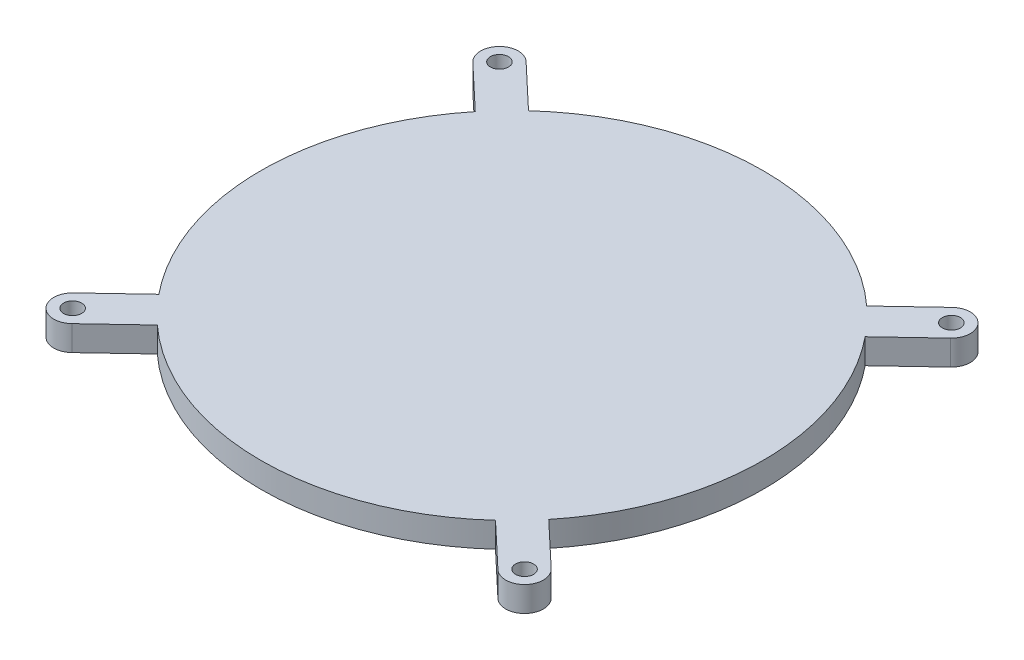
ISO-10303-21;
HEADER;
FILE_DESCRIPTION(('STEP AP214'),'2;1');
FILE_NAME('part.step','',(''),(''),'','','');
FILE_SCHEMA(('AUTOMOTIVE_DESIGN { 1 0 10303 214 1 1 1 1 }'));
ENDSEC;
DATA;
#1=APPLICATION_CONTEXT('core data for automotive mechanical design processes');
#2=APPLICATION_PROTOCOL_DEFINITION('international standard','automotive_design',2000,#1);
#3=PRODUCT_CONTEXT('',#1,'mechanical');
#4=PRODUCT('Part','Part','',(#3));
#5=PRODUCT_RELATED_PRODUCT_CATEGORY('part','',(#4));
#6=PRODUCT_DEFINITION_FORMATION('','',#4);
#7=PRODUCT_DEFINITION_CONTEXT('part definition',#1,'design');
#8=PRODUCT_DEFINITION('design','',#6,#7);
#9=PRODUCT_DEFINITION_SHAPE('','',#8);
#10=(LENGTH_UNIT() NAMED_UNIT(*) SI_UNIT(.MILLI.,.METRE.));
#11=(NAMED_UNIT(*) PLANE_ANGLE_UNIT() SI_UNIT($,.RADIAN.));
#12=(NAMED_UNIT(*) SI_UNIT($,.STERADIAN.) SOLID_ANGLE_UNIT());
#13=UNCERTAINTY_MEASURE_WITH_UNIT(LENGTH_MEASURE(1.E-05),#10,'distance_accuracy_value','');
#14=(GEOMETRIC_REPRESENTATION_CONTEXT(3) GLOBAL_UNCERTAINTY_ASSIGNED_CONTEXT((#13)) GLOBAL_UNIT_ASSIGNED_CONTEXT((#10,
#11,#12)) REPRESENTATION_CONTEXT('',''));
#15=CARTESIAN_POINT('',(0.,0.,0.));
#16=DIRECTION('',(0.,0.,1.));
#17=DIRECTION('',(1.,0.,0.));
#18=AXIS2_PLACEMENT_3D('',#15,#16,#17);
#19=CARTESIAN_POINT('',(45.,5.,-42.5));
#20=DIRECTION('',(0.,-1.,0.));
#21=DIRECTION('',(0.,0.,-1.));
#22=AXIS2_PLACEMENT_3D('',#19,#20,#21);
#23=CYLINDRICAL_SURFACE('',#22,3.75);
#24=CARTESIAN_POINT('',(45.,0.,-42.5));
#25=DIRECTION('',(0.,1.,0.));
#26=DIRECTION('',(0.,0.,1.));
#27=AXIS2_PLACEMENT_3D('',#24,#25,#26);
#28=CIRCLE('',#27,3.75);
#29=CARTESIAN_POINT('',(47.5748382486139,0.,-39.7737006779382));
#30=VERTEX_POINT('',#29);
#31=CARTESIAN_POINT('',(42.425161751386,0.,-45.2262993220618));
#32=VERTEX_POINT('',#31);
#33=EDGE_CURVE('E188',#30,#32,#28,.T.);
#34=ORIENTED_EDGE('',*,*,#33,.T.);
#35=DIRECTION('',(0.,-1.,0.));
#36=VECTOR('',#35,1.);
#37=CARTESIAN_POINT('',(42.425161751386,5.,-45.2262993220618));
#38=LINE('',#37,#36);
#39=CARTESIAN_POINT('',(42.425161751386,5.,-45.2262993220618));
#40=VERTEX_POINT('',#39);
#41=EDGE_CURVE('E11',#40,#32,#38,.T.);
#42=ORIENTED_EDGE('',*,*,#41,.F.);
#43=CARTESIAN_POINT('',(45.,5.,-42.5));
#44=DIRECTION('',(0.,1.,0.));
#45=DIRECTION('',(0.,0.,1.));
#46=AXIS2_PLACEMENT_3D('',#43,#44,#45);
#47=CIRCLE('',#46,3.75);
#48=CARTESIAN_POINT('',(47.5748382486139,5.,-39.7737006779382));
#49=VERTEX_POINT('',#48);
#50=EDGE_CURVE('E235',#49,#40,#47,.T.);
#51=ORIENTED_EDGE('',*,*,#50,.F.);
#52=DIRECTION('',(0.,-1.,0.));
#53=VECTOR('',#52,1.);
#54=CARTESIAN_POINT('',(47.5748382486139,5.,-39.7737006779382));
#55=LINE('',#54,#53);
#56=EDGE_CURVE('E184',#49,#30,#55,.T.);
#57=ORIENTED_EDGE('',*,*,#56,.T.);
#58=EDGE_LOOP('',(#34,#42,#51,#57));
#59=FACE_BOUND('',#58,.T.);
#60=ADVANCED_FACE('F39',(#59),#23,.T.);
#61=CARTESIAN_POINT('',(42.425161751386,5.,-45.2262993220618));
#62=DIRECTION('',(0.68662353296372,0.,0.727013152549814));
#63=DIRECTION('',(0.727013152549814,0.,-0.68662353296372));
#64=AXIS2_PLACEMENT_3D('',#61,#62,#63);
#65=PLANE('',#64);
#66=DIRECTION('',(-0.727013152549814,0.,0.68662353296372));
#67=VECTOR('',#66,1.);
#68=CARTESIAN_POINT('',(42.425161751386,0.,-45.2262993220618));
#69=LINE('',#68,#67);
#70=CARTESIAN_POINT('',(33.6734389788294,0.,-36.9607833702027));
#71=VERTEX_POINT('',#70);
#72=EDGE_CURVE('E192',#32,#71,#69,.T.);
#73=ORIENTED_EDGE('',*,*,#72,.T.);
#74=DIRECTION('',(0.,-1.,0.));
#75=VECTOR('',#74,1.);
#76=CARTESIAN_POINT('',(33.6734389788294,5.,-36.9607833702027));
#77=LINE('',#76,#75);
#78=CARTESIAN_POINT('',(33.6734389788294,5.,-36.9607833702027));
#79=VERTEX_POINT('',#78);
#80=EDGE_CURVE('E48',#79,#71,#77,.T.);
#81=ORIENTED_EDGE('',*,*,#80,.F.);
#82=DIRECTION('',(-0.727013152549814,0.,0.68662353296372));
#83=VECTOR('',#82,1.);
#84=CARTESIAN_POINT('',(42.425161751386,5.,-45.2262993220618));
#85=LINE('',#84,#83);
#86=EDGE_CURVE('E123',#40,#79,#85,.T.);
#87=ORIENTED_EDGE('',*,*,#86,.F.);
#88=ORIENTED_EDGE('',*,*,#41,.T.);
#89=EDGE_LOOP('',(#73,#81,#87,#88));
#90=FACE_BOUND('',#89,.T.);
#91=ADVANCED_FACE('F358',(#90),#65,.F.);
#92=CARTESIAN_POINT('',(0.,5.,0.));
#93=DIRECTION('',(0.,-1.,0.));
#94=DIRECTION('',(0.,0.,-1.));
#95=AXIS2_PLACEMENT_3D('',#92,#93,#94);
#96=CYLINDRICAL_SURFACE('',#95,50.);
#97=CARTESIAN_POINT('',(0.,0.,0.));
#98=DIRECTION('',(0.,1.,0.));
#99=DIRECTION('',(0.,0.,1.));
#100=AXIS2_PLACEMENT_3D('',#97,#98,#99);
#101=CIRCLE('',#100,50.);
#102=CARTESIAN_POINT('',(-33.6734389788294,0.,-36.9607833702027));
#103=VERTEX_POINT('',#102);
#104=EDGE_CURVE('E196',#71,#103,#101,.T.);
#105=ORIENTED_EDGE('',*,*,#104,.T.);
#106=DIRECTION('',(0.,-1.,0.));
#107=VECTOR('',#106,1.);
#108=CARTESIAN_POINT('',(-33.6734389788294,5.,-36.9607833702027));
#109=LINE('',#108,#107);
#110=CARTESIAN_POINT('',(-33.6734389788294,5.,-36.9607833702027));
#111=VERTEX_POINT('',#110);
#112=EDGE_CURVE('E278',#111,#103,#109,.T.);
#113=ORIENTED_EDGE('',*,*,#112,.F.);
#114=CARTESIAN_POINT('',(0.,5.,0.));
#115=DIRECTION('',(0.,1.,0.));
#116=DIRECTION('',(0.,0.,1.));
#117=AXIS2_PLACEMENT_3D('',#114,#115,#116);
#118=CIRCLE('',#117,50.);
#119=EDGE_CURVE('E288',#79,#111,#118,.T.);
#120=ORIENTED_EDGE('',*,*,#119,.F.);
#121=ORIENTED_EDGE('',*,*,#80,.T.);
#122=EDGE_LOOP('',(#105,#113,#120,#121));
#123=FACE_BOUND('',#122,.T.);
#124=ADVANCED_FACE('F286',(#123),#96,.T.);
#125=CARTESIAN_POINT('',(-42.4251617513861,5.,-45.2262993220618));
#126=DIRECTION('',(-0.686623532963716,0.,0.727013152549818));
#127=DIRECTION('',(0.727013152549818,0.,0.686623532963716));
#128=AXIS2_PLACEMENT_3D('',#125,#126,#127);
#129=PLANE('',#128);
#130=DIRECTION('',(-0.727013152549817,0.,-0.686623532963716));
#131=VECTOR('',#130,1.);
#132=CARTESIAN_POINT('',(-42.4251617513861,0.,-45.2262993220618));
#133=LINE('',#132,#131);
#134=CARTESIAN_POINT('',(-42.4251617513861,0.,-45.2262993220618));
#135=VERTEX_POINT('',#134);
#136=EDGE_CURVE('E199',#103,#135,#133,.T.);
#137=ORIENTED_EDGE('',*,*,#136,.T.);
#138=DIRECTION('',(0.,-1.,0.));
#139=VECTOR('',#138,1.);
#140=CARTESIAN_POINT('',(-42.4251617513861,5.,-45.2262993220618));
#141=LINE('',#140,#139);
#142=CARTESIAN_POINT('',(-42.4251617513861,5.,-45.2262993220618));
#143=VERTEX_POINT('',#142);
#144=EDGE_CURVE('E274',#143,#135,#141,.T.);
#145=ORIENTED_EDGE('',*,*,#144,.F.);
#146=DIRECTION('',(-0.727013152549817,0.,-0.686623532963716));
#147=VECTOR('',#146,1.);
#148=CARTESIAN_POINT('',(-42.4251617513861,5.,-45.2262993220618));
#149=LINE('',#148,#147);
#150=EDGE_CURVE('E307',#111,#143,#149,.T.);
#151=ORIENTED_EDGE('',*,*,#150,.F.);
#152=ORIENTED_EDGE('',*,*,#112,.T.);
#153=EDGE_LOOP('',(#137,#145,#151,#152));
#154=FACE_BOUND('',#153,.T.);
#155=ADVANCED_FACE('F297',(#154),#129,.F.);
#156=CARTESIAN_POINT('',(-45.,5.,-42.5));
#157=DIRECTION('',(0.,-1.,0.));
#158=DIRECTION('',(0.,0.,-1.));
#159=AXIS2_PLACEMENT_3D('',#156,#157,#158);
#160=CYLINDRICAL_SURFACE('',#159,3.75);
#161=CARTESIAN_POINT('',(-45.,0.,-42.5));
#162=DIRECTION('',(0.,1.,0.));
#163=DIRECTION('',(0.,0.,1.));
#164=AXIS2_PLACEMENT_3D('',#161,#162,#163);
#165=CIRCLE('',#164,3.75);
#166=CARTESIAN_POINT('',(-47.5748382486139,0.,-39.7737006779382));
#167=VERTEX_POINT('',#166);
#168=EDGE_CURVE('E202',#135,#167,#165,.T.);
#169=ORIENTED_EDGE('',*,*,#168,.T.);
#170=DIRECTION('',(0.,-1.,0.));
#171=VECTOR('',#170,1.);
#172=CARTESIAN_POINT('',(-47.5748382486139,5.,-39.7737006779382));
#173=LINE('',#172,#171);
#174=CARTESIAN_POINT('',(-47.5748382486139,5.,-39.7737006779382));
#175=VERTEX_POINT('',#174);
#176=EDGE_CURVE('E270',#175,#167,#173,.T.);
#177=ORIENTED_EDGE('',*,*,#176,.F.);
#178=CARTESIAN_POINT('',(-45.,5.,-42.5));
#179=DIRECTION('',(0.,1.,0.));
#180=DIRECTION('',(0.,0.,1.));
#181=AXIS2_PLACEMENT_3D('',#178,#179,#180);
#182=CIRCLE('',#181,3.75);
#183=EDGE_CURVE('E303',#143,#175,#182,.T.);
#184=ORIENTED_EDGE('',*,*,#183,.F.);
#185=ORIENTED_EDGE('',*,*,#144,.T.);
#186=EDGE_LOOP('',(#169,#177,#184,#185));
#187=FACE_BOUND('',#186,.T.);
#188=ADVANCED_FACE('F301',(#187),#160,.T.);
#189=CARTESIAN_POINT('',(-47.5748382486139,5.,-39.7737006779382));
#190=DIRECTION('',(0.686623532963717,0.,-0.727013152549817));
#191=DIRECTION('',(-0.727013152549817,0.,-0.686623532963717));
#192=AXIS2_PLACEMENT_3D('',#189,#190,#191);
#193=PLANE('',#192);
#194=DIRECTION('',(0.727013152549817,0.,0.686623532963717));
#195=VECTOR('',#194,1.);
#196=CARTESIAN_POINT('',(-47.5748382486139,0.,-39.7737006779382));
#197=LINE('',#196,#195);
#198=CARTESIAN_POINT('',(-38.8231154760573,0.,-31.5081847260791));
#199=VERTEX_POINT('',#198);
#200=EDGE_CURVE('E205',#167,#199,#197,.T.);
#201=ORIENTED_EDGE('',*,*,#200,.T.);
#202=DIRECTION('',(0.,-1.,0.));
#203=VECTOR('',#202,1.);
#204=CARTESIAN_POINT('',(-38.8231154760573,5.,-31.5081847260791));
#205=LINE('',#204,#203);
#206=CARTESIAN_POINT('',(-38.8231154760573,5.,-31.5081847260791));
#207=VERTEX_POINT('',#206);
#208=EDGE_CURVE('E266',#207,#199,#205,.T.);
#209=ORIENTED_EDGE('',*,*,#208,.F.);
#210=DIRECTION('',(0.727013152549817,0.,0.686623532963717));
#211=VECTOR('',#210,1.);
#212=CARTESIAN_POINT('',(-47.5748382486139,5.,-39.7737006779382));
#213=LINE('',#212,#211);
#214=EDGE_CURVE('E306',#175,#207,#213,.T.);
#215=ORIENTED_EDGE('',*,*,#214,.F.);
#216=ORIENTED_EDGE('',*,*,#176,.T.);
#217=EDGE_LOOP('',(#201,#209,#215,#216));
#218=FACE_BOUND('',#217,.T.);
#219=ADVANCED_FACE('F371',(#218),#193,.F.);
#220=CARTESIAN_POINT('',(0.,5.,0.));
#221=DIRECTION('',(0.,-1.,0.));
#222=DIRECTION('',(0.,0.,-1.));
#223=AXIS2_PLACEMENT_3D('',#220,#221,#222);
#224=CYLINDRICAL_SURFACE('',#223,50.);
#225=CARTESIAN_POINT('',(0.,0.,0.));
#226=DIRECTION('',(0.,1.,0.));
#227=DIRECTION('',(0.,0.,1.));
#228=AXIS2_PLACEMENT_3D('',#225,#226,#227);
#229=CIRCLE('',#228,50.);
#230=CARTESIAN_POINT('',(-38.8231154760573,0.,31.5081847260791));
#231=VERTEX_POINT('',#230);
#232=EDGE_CURVE('E208',#199,#231,#229,.T.);
#233=ORIENTED_EDGE('',*,*,#232,.T.);
#234=DIRECTION('',(0.,-1.,0.));
#235=VECTOR('',#234,1.);
#236=CARTESIAN_POINT('',(-38.8231154760573,5.,31.5081847260791));
#237=LINE('',#236,#235);
#238=CARTESIAN_POINT('',(-38.8231154760573,5.,31.5081847260791));
#239=VERTEX_POINT('',#238);
#240=EDGE_CURVE('E262',#239,#231,#237,.T.);
#241=ORIENTED_EDGE('',*,*,#240,.F.);
#242=CARTESIAN_POINT('',(0.,5.,0.));
#243=DIRECTION('',(0.,1.,0.));
#244=DIRECTION('',(0.,0.,1.));
#245=AXIS2_PLACEMENT_3D('',#242,#243,#244);
#246=CIRCLE('',#245,50.);
#247=EDGE_CURVE('E311',#207,#239,#246,.T.);
#248=ORIENTED_EDGE('',*,*,#247,.F.);
#249=ORIENTED_EDGE('',*,*,#208,.T.);
#250=EDGE_LOOP('',(#233,#241,#248,#249));
#251=FACE_BOUND('',#250,.T.);
#252=ADVANCED_FACE('F374',(#251),#224,.T.);
#253=CARTESIAN_POINT('',(-47.5748382486139,5.,39.7737006779382));
#254=DIRECTION('',(0.686623532963716,0.,0.727013152549818));
#255=DIRECTION('',(0.727013152549818,0.,-0.686623532963716));
#256=AXIS2_PLACEMENT_3D('',#253,#254,#255);
#257=PLANE('',#256);
#258=DIRECTION('',(-0.727013152549818,0.,0.686623532963716));
#259=VECTOR('',#258,1.);
#260=CARTESIAN_POINT('',(-47.5748382486139,0.,39.7737006779382));
#261=LINE('',#260,#259);
#262=CARTESIAN_POINT('',(-47.5748382486139,0.,39.7737006779382));
#263=VERTEX_POINT('',#262);
#264=EDGE_CURVE('E211',#231,#263,#261,.T.);
#265=ORIENTED_EDGE('',*,*,#264,.T.);
#266=DIRECTION('',(0.,-1.,0.));
#267=VECTOR('',#266,1.);
#268=CARTESIAN_POINT('',(-47.5748382486139,5.,39.7737006779382));
#269=LINE('',#268,#267);
#270=CARTESIAN_POINT('',(-47.5748382486139,5.,39.7737006779382));
#271=VERTEX_POINT('',#270);
#272=EDGE_CURVE('E258',#271,#263,#269,.T.);
#273=ORIENTED_EDGE('',*,*,#272,.F.);
#274=DIRECTION('',(-0.727013152549818,0.,0.686623532963716));
#275=VECTOR('',#274,1.);
#276=CARTESIAN_POINT('',(-47.5748382486139,5.,39.7737006779382));
#277=LINE('',#276,#275);
#278=EDGE_CURVE('E318',#239,#271,#277,.T.);
#279=ORIENTED_EDGE('',*,*,#278,.F.);
#280=ORIENTED_EDGE('',*,*,#240,.T.);
#281=EDGE_LOOP('',(#265,#273,#279,#280));
#282=FACE_BOUND('',#281,.T.);
#283=ADVANCED_FACE('F378',(#282),#257,.F.);
#284=CARTESIAN_POINT('',(-45.,5.,42.5));
#285=DIRECTION('',(0.,-1.,0.));
#286=DIRECTION('',(0.,0.,-1.));
#287=AXIS2_PLACEMENT_3D('',#284,#285,#286);
#288=CYLINDRICAL_SURFACE('',#287,3.74999999999999);
#289=CARTESIAN_POINT('',(-45.,0.,42.5));
#290=DIRECTION('',(0.,1.,0.));
#291=DIRECTION('',(0.,0.,1.));
#292=AXIS2_PLACEMENT_3D('',#289,#290,#291);
#293=CIRCLE('',#292,3.74999999999999);
#294=CARTESIAN_POINT('',(-42.4251617513861,0.,45.2262993220618));
#295=VERTEX_POINT('',#294);
#296=EDGE_CURVE('E214',#263,#295,#293,.T.);
#297=ORIENTED_EDGE('',*,*,#296,.T.);
#298=DIRECTION('',(0.,-1.,0.));
#299=VECTOR('',#298,1.);
#300=CARTESIAN_POINT('',(-42.4251617513861,5.,45.2262993220618));
#301=LINE('',#300,#299);
#302=CARTESIAN_POINT('',(-42.4251617513861,5.,45.2262993220618));
#303=VERTEX_POINT('',#302);
#304=EDGE_CURVE('E254',#303,#295,#301,.T.);
#305=ORIENTED_EDGE('',*,*,#304,.F.);
#306=CARTESIAN_POINT('',(-45.,5.,42.5));
#307=DIRECTION('',(0.,1.,0.));
#308=DIRECTION('',(0.,0.,1.));
#309=AXIS2_PLACEMENT_3D('',#306,#307,#308);
#310=CIRCLE('',#309,3.74999999999999);
#311=EDGE_CURVE('E321',#271,#303,#310,.T.);
#312=ORIENTED_EDGE('',*,*,#311,.F.);
#313=ORIENTED_EDGE('',*,*,#272,.T.);
#314=EDGE_LOOP('',(#297,#305,#312,#313));
#315=FACE_BOUND('',#314,.T.);
#316=ADVANCED_FACE('F382',(#315),#288,.T.);
#317=CARTESIAN_POINT('',(-42.4251617513861,5.,45.2262993220618));
#318=DIRECTION('',(-0.686623532963718,0.,-0.727013152549816));
#319=DIRECTION('',(-0.727013152549816,0.,0.686623532963718));
#320=AXIS2_PLACEMENT_3D('',#317,#318,#319);
#321=PLANE('',#320);
#322=DIRECTION('',(0.727013152549816,0.,-0.686623532963718));
#323=VECTOR('',#322,1.);
#324=CARTESIAN_POINT('',(-42.4251617513861,0.,45.2262993220618));
#325=LINE('',#324,#323);
#326=CARTESIAN_POINT('',(-33.6734389788294,0.,36.9607833702027));
#327=VERTEX_POINT('',#326);
#328=EDGE_CURVE('E217',#295,#327,#325,.T.);
#329=ORIENTED_EDGE('',*,*,#328,.T.);
#330=DIRECTION('',(0.,-1.,0.));
#331=VECTOR('',#330,1.);
#332=CARTESIAN_POINT('',(-33.6734389788294,5.,36.9607833702027));
#333=LINE('',#332,#331);
#334=CARTESIAN_POINT('',(-33.6734389788294,5.,36.9607833702027));
#335=VERTEX_POINT('',#334);
#336=EDGE_CURVE('E250',#335,#327,#333,.T.);
#337=ORIENTED_EDGE('',*,*,#336,.F.);
#338=DIRECTION('',(0.727013152549816,0.,-0.686623532963718));
#339=VECTOR('',#338,1.);
#340=CARTESIAN_POINT('',(-42.4251617513861,5.,45.2262993220618));
#341=LINE('',#340,#339);
#342=EDGE_CURVE('E324',#303,#335,#341,.T.);
#343=ORIENTED_EDGE('',*,*,#342,.F.);
#344=ORIENTED_EDGE('',*,*,#304,.T.);
#345=EDGE_LOOP('',(#329,#337,#343,#344));
#346=FACE_BOUND('',#345,.T.);
#347=ADVANCED_FACE('F386',(#346),#321,.F.);
#348=CARTESIAN_POINT('',(0.,5.,0.));
#349=DIRECTION('',(0.,-1.,0.));
#350=DIRECTION('',(0.,0.,-1.));
#351=AXIS2_PLACEMENT_3D('',#348,#349,#350);
#352=CYLINDRICAL_SURFACE('',#351,50.);
#353=CARTESIAN_POINT('',(0.,0.,0.));
#354=DIRECTION('',(0.,1.,0.));
#355=DIRECTION('',(0.,0.,1.));
#356=AXIS2_PLACEMENT_3D('',#353,#354,#355);
#357=CIRCLE('',#356,50.);
#358=CARTESIAN_POINT('',(33.6734389788294,0.,36.9607833702027));
#359=VERTEX_POINT('',#358);
#360=EDGE_CURVE('E220',#327,#359,#357,.T.);
#361=ORIENTED_EDGE('',*,*,#360,.T.);
#362=DIRECTION('',(0.,-1.,0.));
#363=VECTOR('',#362,1.);
#364=CARTESIAN_POINT('',(33.6734389788294,5.,36.9607833702027));
#365=LINE('',#364,#363);
#366=CARTESIAN_POINT('',(33.6734389788294,5.,36.9607833702027));
#367=VERTEX_POINT('',#366);
#368=EDGE_CURVE('E246',#367,#359,#365,.T.);
#369=ORIENTED_EDGE('',*,*,#368,.F.);
#370=CARTESIAN_POINT('',(0.,5.,0.));
#371=DIRECTION('',(0.,1.,0.));
#372=DIRECTION('',(0.,0.,1.));
#373=AXIS2_PLACEMENT_3D('',#370,#371,#372);
#374=CIRCLE('',#373,50.);
#375=EDGE_CURVE('E327',#335,#367,#374,.T.);
#376=ORIENTED_EDGE('',*,*,#375,.F.);
#377=ORIENTED_EDGE('',*,*,#336,.T.);
#378=EDGE_LOOP('',(#361,#369,#376,#377));
#379=FACE_BOUND('',#378,.T.);
#380=ADVANCED_FACE('F390',(#379),#352,.T.);
#381=CARTESIAN_POINT('',(42.4251617513861,5.,45.2262993220618));
#382=DIRECTION('',(0.686623532963718,0.,-0.727013152549816));
#383=DIRECTION('',(-0.727013152549816,0.,-0.686623532963718));
#384=AXIS2_PLACEMENT_3D('',#381,#382,#383);
#385=PLANE('',#384);
#386=DIRECTION('',(0.727013152549816,0.,0.686623532963718));
#387=VECTOR('',#386,1.);
#388=CARTESIAN_POINT('',(42.4251617513861,0.,45.2262993220618));
#389=LINE('',#388,#387);
#390=CARTESIAN_POINT('',(42.4251617513861,0.,45.2262993220618));
#391=VERTEX_POINT('',#390);
#392=EDGE_CURVE('E223',#359,#391,#389,.T.);
#393=ORIENTED_EDGE('',*,*,#392,.T.);
#394=DIRECTION('',(0.,-1.,0.));
#395=VECTOR('',#394,1.);
#396=CARTESIAN_POINT('',(42.4251617513861,5.,45.2262993220618));
#397=LINE('',#396,#395);
#398=CARTESIAN_POINT('',(42.4251617513861,5.,45.2262993220618));
#399=VERTEX_POINT('',#398);
#400=EDGE_CURVE('E242',#399,#391,#397,.T.);
#401=ORIENTED_EDGE('',*,*,#400,.F.);
#402=DIRECTION('',(0.727013152549816,0.,0.686623532963718));
#403=VECTOR('',#402,1.);
#404=CARTESIAN_POINT('',(42.4251617513861,5.,45.2262993220618));
#405=LINE('',#404,#403);
#406=EDGE_CURVE('E330',#367,#399,#405,.T.);
#407=ORIENTED_EDGE('',*,*,#406,.F.);
#408=ORIENTED_EDGE('',*,*,#368,.T.);
#409=EDGE_LOOP('',(#393,#401,#407,#408));
#410=FACE_BOUND('',#409,.T.);
#411=ADVANCED_FACE('F338',(#410),#385,.F.);
#412=CARTESIAN_POINT('',(45.,5.,42.5));
#413=DIRECTION('',(0.,-1.,0.));
#414=DIRECTION('',(0.,0.,-1.));
#415=AXIS2_PLACEMENT_3D('',#412,#413,#414);
#416=CYLINDRICAL_SURFACE('',#415,3.75);
#417=CARTESIAN_POINT('',(45.,0.,42.5));
#418=DIRECTION('',(0.,1.,0.));
#419=DIRECTION('',(0.,0.,1.));
#420=AXIS2_PLACEMENT_3D('',#417,#418,#419);
#421=CIRCLE('',#420,3.75);
#422=CARTESIAN_POINT('',(47.574838248614,0.,39.7737006779382));
#423=VERTEX_POINT('',#422);
#424=EDGE_CURVE('E226',#391,#423,#421,.T.);
#425=ORIENTED_EDGE('',*,*,#424,.T.);
#426=DIRECTION('',(0.,-1.,0.));
#427=VECTOR('',#426,1.);
#428=CARTESIAN_POINT('',(47.574838248614,5.,39.7737006779382));
#429=LINE('',#428,#427);
#430=CARTESIAN_POINT('',(47.574838248614,5.,39.7737006779382));
#431=VERTEX_POINT('',#430);
#432=EDGE_CURVE('E177',#431,#423,#429,.T.);
#433=ORIENTED_EDGE('',*,*,#432,.F.);
#434=CARTESIAN_POINT('',(45.,5.,42.5));
#435=DIRECTION('',(0.,1.,0.));
#436=DIRECTION('',(0.,0.,1.));
#437=AXIS2_PLACEMENT_3D('',#434,#435,#436);
#438=CIRCLE('',#437,3.75);
#439=EDGE_CURVE('E166',#399,#431,#438,.T.);
#440=ORIENTED_EDGE('',*,*,#439,.F.);
#441=ORIENTED_EDGE('',*,*,#400,.T.);
#442=EDGE_LOOP('',(#425,#433,#440,#441));
#443=FACE_BOUND('',#442,.T.);
#444=ADVANCED_FACE('F342',(#443),#416,.T.);
#445=CARTESIAN_POINT('',(47.574838248614,5.,39.7737006779382));
#446=DIRECTION('',(-0.686623532963718,0.,0.727013152549816));
#447=DIRECTION('',(0.727013152549816,0.,0.686623532963718));
#448=AXIS2_PLACEMENT_3D('',#445,#446,#447);
#449=PLANE('',#448);
#450=DIRECTION('',(-0.727013152549816,0.,-0.686623532963718));
#451=VECTOR('',#450,1.);
#452=CARTESIAN_POINT('',(47.574838248614,0.,39.7737006779382));
#453=LINE('',#452,#451);
#454=CARTESIAN_POINT('',(38.8231154760573,0.,31.5081847260791));
#455=VERTEX_POINT('',#454);
#456=EDGE_CURVE('E175',#423,#455,#453,.T.);
#457=ORIENTED_EDGE('',*,*,#456,.T.);
#458=DIRECTION('',(0.,-1.,0.));
#459=VECTOR('',#458,1.);
#460=CARTESIAN_POINT('',(38.8231154760573,5.,31.5081847260791));
#461=LINE('',#460,#459);
#462=CARTESIAN_POINT('',(38.8231154760573,5.,31.5081847260791));
#463=VERTEX_POINT('',#462);
#464=EDGE_CURVE('E172',#463,#455,#461,.T.);
#465=ORIENTED_EDGE('',*,*,#464,.F.);
#466=DIRECTION('',(-0.727013152549816,0.,-0.686623532963718));
#467=VECTOR('',#466,1.);
#468=CARTESIAN_POINT('',(47.574838248614,5.,39.7737006779382));
#469=LINE('',#468,#467);
#470=EDGE_CURVE('E160',#431,#463,#469,.T.);
#471=ORIENTED_EDGE('',*,*,#470,.F.);
#472=ORIENTED_EDGE('',*,*,#432,.T.);
#473=EDGE_LOOP('',(#457,#465,#471,#472));
#474=FACE_BOUND('',#473,.T.);
#475=ADVANCED_FACE('F173',(#474),#449,.F.);
#476=CARTESIAN_POINT('',(0.,5.,0.));
#477=DIRECTION('',(0.,-1.,0.));
#478=DIRECTION('',(0.,0.,-1.));
#479=AXIS2_PLACEMENT_3D('',#476,#477,#478);
#480=CYLINDRICAL_SURFACE('',#479,50.);
#481=CARTESIAN_POINT('',(0.,0.,0.));
#482=DIRECTION('',(0.,1.,0.));
#483=DIRECTION('',(0.,0.,1.));
#484=AXIS2_PLACEMENT_3D('',#481,#482,#483);
#485=CIRCLE('',#484,50.);
#486=CARTESIAN_POINT('',(38.8231154760572,0.,-31.5081847260791));
#487=VERTEX_POINT('',#486);
#488=EDGE_CURVE('E109',#455,#487,#485,.T.);
#489=ORIENTED_EDGE('',*,*,#488,.T.);
#490=DIRECTION('',(0.,-1.,0.));
#491=VECTOR('',#490,1.);
#492=CARTESIAN_POINT('',(38.8231154760572,5.,-31.5081847260791));
#493=LINE('',#492,#491);
#494=CARTESIAN_POINT('',(38.8231154760572,5.,-31.5081847260791));
#495=VERTEX_POINT('',#494);
#496=EDGE_CURVE('E178',#495,#487,#493,.T.);
#497=ORIENTED_EDGE('',*,*,#496,.F.);
#498=CARTESIAN_POINT('',(0.,5.,0.));
#499=DIRECTION('',(0.,1.,0.));
#500=DIRECTION('',(0.,0.,1.));
#501=AXIS2_PLACEMENT_3D('',#498,#499,#500);
#502=CIRCLE('',#501,50.);
#503=EDGE_CURVE('E164',#463,#495,#502,.T.);
#504=ORIENTED_EDGE('',*,*,#503,.F.);
#505=ORIENTED_EDGE('',*,*,#464,.T.);
#506=EDGE_LOOP('',(#489,#497,#504,#505));
#507=FACE_BOUND('',#506,.T.);
#508=ADVANCED_FACE('F180',(#507),#480,.T.);
#509=CARTESIAN_POINT('',(47.5748382486139,5.,-39.7737006779382));
#510=DIRECTION('',(-0.686623532963714,0.,-0.72701315254982));
#511=DIRECTION('',(-0.72701315254982,0.,0.686623532963714));
#512=AXIS2_PLACEMENT_3D('',#509,#510,#511);
#513=PLANE('',#512);
#514=DIRECTION('',(0.72701315254982,0.,-0.686623532963714));
#515=VECTOR('',#514,1.);
#516=CARTESIAN_POINT('',(47.5748382486139,0.,-39.7737006779382));
#517=LINE('',#516,#515);
#518=EDGE_CURVE('E115',#487,#30,#517,.T.);
#519=ORIENTED_EDGE('',*,*,#518,.T.);
#520=ORIENTED_EDGE('',*,*,#56,.F.);
#521=DIRECTION('',(0.72701315254982,0.,-0.686623532963714));
#522=VECTOR('',#521,1.);
#523=CARTESIAN_POINT('',(47.5748382486139,5.,-39.7737006779382));
#524=LINE('',#523,#522);
#525=EDGE_CURVE('E56',#495,#49,#524,.T.);
#526=ORIENTED_EDGE('',*,*,#525,.F.);
#527=ORIENTED_EDGE('',*,*,#496,.T.);
#528=EDGE_LOOP('',(#519,#520,#526,#527));
#529=FACE_BOUND('',#528,.T.);
#530=ADVANCED_FACE('F346',(#529),#513,.F.);
#531=CARTESIAN_POINT('',(45.,5.,-42.5));
#532=DIRECTION('',(0.,1.,0.));
#533=DIRECTION('',(0.,0.,1.));
#534=AXIS2_PLACEMENT_3D('',#531,#532,#533);
#535=PLANE('',#534);
#536=CARTESIAN_POINT('',(-45.,5.,42.5));
#537=DIRECTION('',(0.,1.,0.));
#538=DIRECTION('',(0.,0.,1.));
#539=AXIS2_PLACEMENT_3D('',#536,#537,#538);
#540=CIRCLE('',#539,1.79999999999999);
#541=CARTESIAN_POINT('',(-45.,5.,44.3));
#542=VERTEX_POINT('',#541);
#543=EDGE_CURVE('E476',#542,#542,#540,.T.);
#544=ORIENTED_EDGE('',*,*,#543,.F.);
#545=EDGE_LOOP('',(#544));
#546=FACE_BOUND('',#545,.T.);
#547=CARTESIAN_POINT('',(-45.,5.,-42.5));
#548=DIRECTION('',(0.,1.,0.));
#549=DIRECTION('',(0.,0.,1.));
#550=AXIS2_PLACEMENT_3D('',#547,#548,#549);
#551=CIRCLE('',#550,1.79999999999999);
#552=CARTESIAN_POINT('',(-45.,5.,-40.7));
#553=VERTEX_POINT('',#552);
#554=EDGE_CURVE('E480',#553,#553,#551,.T.);
#555=ORIENTED_EDGE('',*,*,#554,.F.);
#556=EDGE_LOOP('',(#555));
#557=FACE_BOUND('',#556,.T.);
#558=CARTESIAN_POINT('',(45.,5.,-42.5));
#559=DIRECTION('',(0.,1.,0.));
#560=DIRECTION('',(0.,0.,1.));
#561=AXIS2_PLACEMENT_3D('',#558,#559,#560);
#562=CIRCLE('',#561,1.79999999999999);
#563=CARTESIAN_POINT('',(45.,5.,-40.7));
#564=VERTEX_POINT('',#563);
#565=EDGE_CURVE('E490',#564,#564,#562,.T.);
#566=ORIENTED_EDGE('',*,*,#565,.F.);
#567=EDGE_LOOP('',(#566));
#568=FACE_BOUND('',#567,.T.);
#569=CARTESIAN_POINT('',(45.,5.,42.5));
#570=DIRECTION('',(0.,1.,0.));
#571=DIRECTION('',(0.,0.,1.));
#572=AXIS2_PLACEMENT_3D('',#569,#570,#571);
#573=CIRCLE('',#572,1.79999999999999);
#574=CARTESIAN_POINT('',(45.,5.,44.3));
#575=VERTEX_POINT('',#574);
#576=EDGE_CURVE('E498',#575,#575,#573,.T.);
#577=ORIENTED_EDGE('',*,*,#576,.F.);
#578=EDGE_LOOP('',(#577));
#579=FACE_BOUND('',#578,.T.);
#580=ORIENTED_EDGE('',*,*,#50,.T.);
#581=ORIENTED_EDGE('',*,*,#86,.T.);
#582=ORIENTED_EDGE('',*,*,#119,.T.);
#583=ORIENTED_EDGE('',*,*,#150,.T.);
#584=ORIENTED_EDGE('',*,*,#183,.T.);
#585=ORIENTED_EDGE('',*,*,#214,.T.);
#586=ORIENTED_EDGE('',*,*,#247,.T.);
#587=ORIENTED_EDGE('',*,*,#278,.T.);
#588=ORIENTED_EDGE('',*,*,#311,.T.);
#589=ORIENTED_EDGE('',*,*,#342,.T.);
#590=ORIENTED_EDGE('',*,*,#375,.T.);
#591=ORIENTED_EDGE('',*,*,#406,.T.);
#592=ORIENTED_EDGE('',*,*,#439,.T.);
#593=ORIENTED_EDGE('',*,*,#470,.T.);
#594=ORIENTED_EDGE('',*,*,#503,.T.);
#595=ORIENTED_EDGE('',*,*,#525,.T.);
#596=EDGE_LOOP('',(#580,#581,#582,#583,#584,#585,#586,#587,#588,#589,#590,#591,#592,#593,#594,#595));
#597=FACE_BOUND('',#596,.T.);
#598=ADVANCED_FACE('F162',(#546,#557,#568,#579,#597),#535,.T.);
#599=CARTESIAN_POINT('',(45.,0.,-42.5));
#600=DIRECTION('',(0.,1.,0.));
#601=DIRECTION('',(0.,0.,1.));
#602=AXIS2_PLACEMENT_3D('',#599,#600,#601);
#603=PLANE('',#602);
#604=CARTESIAN_POINT('',(-45.,0.,42.5));
#605=DIRECTION('',(0.,1.,0.));
#606=DIRECTION('',(0.,0.,1.));
#607=AXIS2_PLACEMENT_3D('',#604,#605,#606);
#608=CIRCLE('',#607,1.8);
#609=CARTESIAN_POINT('',(-45.,0.,44.3));
#610=VERTEX_POINT('',#609);
#611=EDGE_CURVE('E473',#610,#610,#608,.T.);
#612=ORIENTED_EDGE('',*,*,#611,.T.);
#613=EDGE_LOOP('',(#612));
#614=FACE_BOUND('',#613,.T.);
#615=CARTESIAN_POINT('',(-45.,0.,-42.5));
#616=DIRECTION('',(0.,1.,0.));
#617=DIRECTION('',(0.,0.,1.));
#618=AXIS2_PLACEMENT_3D('',#615,#616,#617);
#619=CIRCLE('',#618,1.8);
#620=CARTESIAN_POINT('',(-45.,0.,-40.7));
#621=VERTEX_POINT('',#620);
#622=EDGE_CURVE('E486',#621,#621,#619,.T.);
#623=ORIENTED_EDGE('',*,*,#622,.T.);
#624=EDGE_LOOP('',(#623));
#625=FACE_BOUND('',#624,.T.);
#626=CARTESIAN_POINT('',(45.,0.,-42.5));
#627=DIRECTION('',(0.,1.,0.));
#628=DIRECTION('',(0.,0.,1.));
#629=AXIS2_PLACEMENT_3D('',#626,#627,#628);
#630=CIRCLE('',#629,1.8);
#631=CARTESIAN_POINT('',(45.,0.,-40.7));
#632=VERTEX_POINT('',#631);
#633=EDGE_CURVE('E494',#632,#632,#630,.T.);
#634=ORIENTED_EDGE('',*,*,#633,.T.);
#635=EDGE_LOOP('',(#634));
#636=FACE_BOUND('',#635,.T.);
#637=CARTESIAN_POINT('',(45.,0.,42.5));
#638=DIRECTION('',(0.,1.,0.));
#639=DIRECTION('',(0.,0.,1.));
#640=AXIS2_PLACEMENT_3D('',#637,#638,#639);
#641=CIRCLE('',#640,1.8);
#642=CARTESIAN_POINT('',(45.,0.,44.3));
#643=VERTEX_POINT('',#642);
#644=EDGE_CURVE('E193',#643,#643,#641,.T.);
#645=ORIENTED_EDGE('',*,*,#644,.T.);
#646=EDGE_LOOP('',(#645));
#647=FACE_BOUND('',#646,.T.);
#648=ORIENTED_EDGE('',*,*,#33,.F.);
#649=ORIENTED_EDGE('',*,*,#518,.F.);
#650=ORIENTED_EDGE('',*,*,#488,.F.);
#651=ORIENTED_EDGE('',*,*,#456,.F.);
#652=ORIENTED_EDGE('',*,*,#424,.F.);
#653=ORIENTED_EDGE('',*,*,#392,.F.);
#654=ORIENTED_EDGE('',*,*,#360,.F.);
#655=ORIENTED_EDGE('',*,*,#328,.F.);
#656=ORIENTED_EDGE('',*,*,#296,.F.);
#657=ORIENTED_EDGE('',*,*,#264,.F.);
#658=ORIENTED_EDGE('',*,*,#232,.F.);
#659=ORIENTED_EDGE('',*,*,#200,.F.);
#660=ORIENTED_EDGE('',*,*,#168,.F.);
#661=ORIENTED_EDGE('',*,*,#136,.F.);
#662=ORIENTED_EDGE('',*,*,#104,.F.);
#663=ORIENTED_EDGE('',*,*,#72,.F.);
#664=EDGE_LOOP('',(#648,#649,#650,#651,#652,#653,#654,#655,#656,#657,#658,#659,#660,#661,#662,#663));
#665=FACE_BOUND('',#664,.T.);
#666=ADVANCED_FACE('F292',(#614,#625,#636,#647,#665),#603,.F.);
#667=CARTESIAN_POINT('',(45.,5.,42.5));
#668=DIRECTION('',(0.,1.,0.));
#669=DIRECTION('',(0.,0.,1.));
#670=AXIS2_PLACEMENT_3D('',#667,#668,#669);
#671=CYLINDRICAL_SURFACE('',#670,1.79999999999999);
#672=ORIENTED_EDGE('',*,*,#644,.F.);
#673=EDGE_LOOP('',(#672));
#674=FACE_BOUND('',#673,.T.);
#675=ORIENTED_EDGE('',*,*,#576,.T.);
#676=EDGE_LOOP('',(#675));
#677=FACE_BOUND('',#676,.T.);
#678=ADVANCED_FACE('F427',(#674,#677),#671,.F.);
#679=CARTESIAN_POINT('',(45.,5.,-42.5));
#680=DIRECTION('',(0.,1.,0.));
#681=DIRECTION('',(0.,0.,1.));
#682=AXIS2_PLACEMENT_3D('',#679,#680,#681);
#683=CYLINDRICAL_SURFACE('',#682,1.79999999999999);
#684=ORIENTED_EDGE('',*,*,#633,.F.);
#685=EDGE_LOOP('',(#684));
#686=FACE_BOUND('',#685,.T.);
#687=ORIENTED_EDGE('',*,*,#565,.T.);
#688=EDGE_LOOP('',(#687));
#689=FACE_BOUND('',#688,.T.);
#690=ADVANCED_FACE('F436',(#686,#689),#683,.F.);
#691=CARTESIAN_POINT('',(-45.,5.,-42.5));
#692=DIRECTION('',(0.,1.,0.));
#693=DIRECTION('',(0.,0.,1.));
#694=AXIS2_PLACEMENT_3D('',#691,#692,#693);
#695=CYLINDRICAL_SURFACE('',#694,1.79999999999999);
#696=ORIENTED_EDGE('',*,*,#622,.F.);
#697=EDGE_LOOP('',(#696));
#698=FACE_BOUND('',#697,.T.);
#699=ORIENTED_EDGE('',*,*,#554,.T.);
#700=EDGE_LOOP('',(#699));
#701=FACE_BOUND('',#700,.T.);
#702=ADVANCED_FACE('F446',(#698,#701),#695,.F.);
#703=CARTESIAN_POINT('',(-45.,5.,42.5));
#704=DIRECTION('',(0.,1.,0.));
#705=DIRECTION('',(0.,0.,1.));
#706=AXIS2_PLACEMENT_3D('',#703,#704,#705);
#707=CYLINDRICAL_SURFACE('',#706,1.79999999999999);
#708=ORIENTED_EDGE('',*,*,#611,.F.);
#709=EDGE_LOOP('',(#708));
#710=FACE_BOUND('',#709,.T.);
#711=ORIENTED_EDGE('',*,*,#543,.T.);
#712=EDGE_LOOP('',(#711));
#713=FACE_BOUND('',#712,.T.);
#714=ADVANCED_FACE('F456',(#710,#713),#707,.F.);
#715=CLOSED_SHELL('',(#60,#91,#124,#155,#188,#219,#252,#283,#316,#347,#380,#411,#444,#475,#508,
#530,#598,#666,#678,#690,#702,#714));
#716=MANIFOLD_SOLID_BREP('B2',#715);
#717=ADVANCED_BREP_SHAPE_REPRESENTATION('',(#18,#716),#14);
#718=SHAPE_DEFINITION_REPRESENTATION(#9,#717);
ENDSEC;
END-ISO-10303-21;
